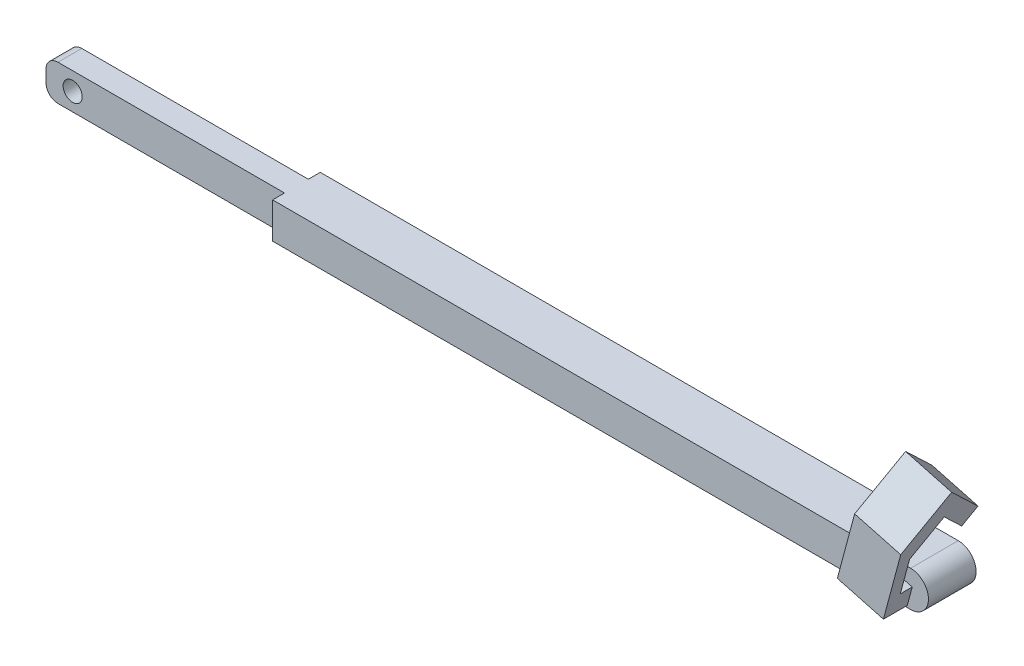
ISO-10303-21;
HEADER;
FILE_DESCRIPTION(('STEP AP214'),'2;1');
FILE_NAME('part.step','',(''),(''),'','','');
FILE_SCHEMA(('AUTOMOTIVE_DESIGN { 1 0 10303 214 1 1 1 1 }'));
ENDSEC;
DATA;
#1=APPLICATION_CONTEXT('core data for automotive mechanical design processes');
#2=APPLICATION_PROTOCOL_DEFINITION('international standard','automotive_design',2000,#1);
#3=PRODUCT_CONTEXT('',#1,'mechanical');
#4=PRODUCT('Part','Part','',(#3));
#5=PRODUCT_RELATED_PRODUCT_CATEGORY('part','',(#4));
#6=PRODUCT_DEFINITION_FORMATION('','',#4);
#7=PRODUCT_DEFINITION_CONTEXT('part definition',#1,'design');
#8=PRODUCT_DEFINITION('design','',#6,#7);
#9=PRODUCT_DEFINITION_SHAPE('','',#8);
#10=(LENGTH_UNIT() NAMED_UNIT(*) SI_UNIT(.MILLI.,.METRE.));
#11=(NAMED_UNIT(*) PLANE_ANGLE_UNIT() SI_UNIT($,.RADIAN.));
#12=(NAMED_UNIT(*) SI_UNIT($,.STERADIAN.) SOLID_ANGLE_UNIT());
#13=UNCERTAINTY_MEASURE_WITH_UNIT(LENGTH_MEASURE(1.E-05),#10,'distance_accuracy_value','');
#14=(GEOMETRIC_REPRESENTATION_CONTEXT(3) GLOBAL_UNCERTAINTY_ASSIGNED_CONTEXT((#13)) GLOBAL_UNIT_ASSIGNED_CONTEXT((#10,
#11,#12)) REPRESENTATION_CONTEXT('',''));
#15=CARTESIAN_POINT('',(0.,0.,0.));
#16=DIRECTION('',(0.,0.,1.));
#17=DIRECTION('',(1.,0.,0.));
#18=AXIS2_PLACEMENT_3D('',#15,#16,#17);
#19=CARTESIAN_POINT('',(-43.75,-3.74999999999999,-0.935028842544244));
#20=DIRECTION('',(1.,0.,0.));
#21=DIRECTION('',(0.,0.,-1.));
#22=AXIS2_PLACEMENT_3D('',#19,#20,#21);
#23=PLANE('',#22);
#24=DIRECTION('',(0.,-1.,0.));
#25=VECTOR('',#24,1.);
#26=CARTESIAN_POINT('',(-43.75,-3.74999999999999,2.5));
#27=LINE('',#26,#25);
#28=CARTESIAN_POINT('',(-43.75,3.75000000000002,2.5));
#29=VERTEX_POINT('',#28);
#30=CARTESIAN_POINT('',(-43.75,-3.74999999999999,2.5));
#31=VERTEX_POINT('',#30);
#32=EDGE_CURVE('E197',#29,#31,#27,.T.);
#33=ORIENTED_EDGE('',*,*,#32,.F.);
#34=DIRECTION('',(0.,0.,1.));
#35=VECTOR('',#34,1.);
#36=CARTESIAN_POINT('',(-43.75,3.75000000000002,10.));
#37=LINE('',#36,#35);
#38=CARTESIAN_POINT('',(-43.75,3.74999999999999,0.));
#39=VERTEX_POINT('',#38);
#40=EDGE_CURVE('E192',#39,#29,#37,.T.);
#41=ORIENTED_EDGE('',*,*,#40,.F.);
#42=DIRECTION('',(0.,1.,0.));
#43=VECTOR('',#42,1.);
#44=CARTESIAN_POINT('',(-43.75,0.,0.));
#45=LINE('',#44,#43);
#46=CARTESIAN_POINT('',(-43.75,-3.74999999999999,0.));
#47=VERTEX_POINT('',#46);
#48=EDGE_CURVE('E299',#47,#39,#45,.T.);
#49=ORIENTED_EDGE('',*,*,#48,.F.);
#50=DIRECTION('',(0.,0.,1.));
#51=VECTOR('',#50,1.);
#52=CARTESIAN_POINT('',(-43.75,-3.74999999999999,-0.935028842544244));
#53=LINE('',#52,#51);
#54=EDGE_CURVE('E302',#47,#31,#53,.T.);
#55=ORIENTED_EDGE('',*,*,#54,.T.);
#56=EDGE_LOOP('',(#33,#41,#49,#55));
#57=FACE_BOUND('',#56,.T.);
#58=ADVANCED_FACE('F35',(#57),#23,.F.);
#59=DIRECTION('',(0.,1.,0.));
#60=VECTOR('',#59,1.);
#61=CARTESIAN_POINT('',(-43.75,-3.74999999999999,7.5));
#62=LINE('',#61,#60);
#63=CARTESIAN_POINT('',(-43.75,-3.74999999999999,7.5));
#64=VERTEX_POINT('',#63);
#65=CARTESIAN_POINT('',(-43.75,3.74999999999999,7.5));
#66=VERTEX_POINT('',#65);
#67=EDGE_CURVE('E187',#64,#66,#62,.T.);
#68=ORIENTED_EDGE('',*,*,#67,.F.);
#69=CARTESIAN_POINT('',(-43.75,-3.74999999999999,10.));
#70=VERTEX_POINT('',#69);
#71=EDGE_CURVE('E291',#64,#70,#53,.T.);
#72=ORIENTED_EDGE('',*,*,#71,.T.);
#73=DIRECTION('',(0.,1.,0.));
#74=VECTOR('',#73,1.);
#75=CARTESIAN_POINT('',(-43.75,-3.74999999999999,10.));
#76=LINE('',#75,#74);
#77=CARTESIAN_POINT('',(-43.75,3.75000000000002,10.));
#78=VERTEX_POINT('',#77);
#79=EDGE_CURVE('E190',#70,#78,#76,.T.);
#80=ORIENTED_EDGE('',*,*,#79,.T.);
#81=EDGE_CURVE('E174',#66,#78,#37,.T.);
#82=ORIENTED_EDGE('',*,*,#81,.F.);
#83=EDGE_LOOP('',(#68,#72,#80,#82));
#84=FACE_BOUND('',#83,.T.);
#85=ADVANCED_FACE('F186',(#84),#23,.F.);
#86=CARTESIAN_POINT('',(94.4844666662507,15.950725063181,4.0147186257616));
#87=DIRECTION('',(0.18301270189222,0.683012701892216,0.70710678118655));
#88=DIRECTION('',(0.,-0.719254596676406,0.694746590606863));
#89=AXIS2_PLACEMENT_3D('',#86,#87,#88);
#90=PLANE('',#89);
#91=DIRECTION('',(-0.965925826289068,0.258819045102522,0.));
#92=VECTOR('',#91,1.);
#93=CARTESIAN_POINT('',(93.7816978909845,13.3279562879149,6.73000866551794));
#94=LINE('',#93,#92);
#95=CARTESIAN_POINT('',(93.7816978909845,13.3279562879149,6.73000866551794));
#96=VERTEX_POINT('',#95);
#97=CARTESIAN_POINT('',(84.1224396280939,15.9161467389401,6.73000866551794));
#98=VERTEX_POINT('',#97);
#99=EDGE_CURVE('E278',#96,#98,#94,.T.);
#100=ORIENTED_EDGE('',*,*,#99,.F.);
#101=DIRECTION('',(-0.183012701892221,-0.683012701892222,0.707106781186545));
#102=VECTOR('',#101,1.);
#103=CARTESIAN_POINT('',(94.4844666662507,15.950725063181,4.0147186257616));
#104=LINE('',#103,#102);
#105=CARTESIAN_POINT('',(92.288314243544,7.75457264047446,12.5));
#106=VERTEX_POINT('',#105);
#107=EDGE_CURVE('E210',#96,#106,#104,.T.);
#108=ORIENTED_EDGE('',*,*,#107,.T.);
#109=DIRECTION('',(0.965925826289068,-0.258819045102522,0.));
#110=VECTOR('',#109,1.);
#111=CARTESIAN_POINT('',(82.6290559806534,10.3427630914997,12.5));
#112=LINE('',#111,#110);
#113=CARTESIAN_POINT('',(82.6290559806534,10.3427630914997,12.5));
#114=VERTEX_POINT('',#113);
#115=EDGE_CURVE('E214',#114,#106,#112,.T.);
#116=ORIENTED_EDGE('',*,*,#115,.F.);
#117=DIRECTION('',(-0.183012701892221,-0.683012701892222,0.707106781186545));
#118=VECTOR('',#117,1.);
#119=CARTESIAN_POINT('',(84.82520840336,18.5389155142062,4.0147186257616));
#120=LINE('',#119,#118);
#121=EDGE_CURVE('E262',#98,#114,#120,.T.);
#122=ORIENTED_EDGE('',*,*,#121,.F.);
#123=EDGE_LOOP('',(#100,#108,#116,#122));
#124=FACE_BOUND('',#123,.T.);
#125=ADVANCED_FACE('F357',(#124),#90,.F.);
#126=CARTESIAN_POINT('',(80.6879131423844,3.09831939433166,15.));
#127=DIRECTION('',(-0.258819045102522,-0.965925826289068,0.));
#128=DIRECTION('',(0.965925826289068,-0.258819045102522,0.));
#129=AXIS2_PLACEMENT_3D('',#126,#127,#128);
#130=PLANE('',#129);
#131=DIRECTION('',(-0.965925826289068,0.258819045102522,0.));
#132=VECTOR('',#131,1.);
#133=CARTESIAN_POINT('',(80.6879131423844,3.09831939433167,12.5));
#134=LINE('',#133,#132);
#135=CARTESIAN_POINT('',(90.3471714052751,0.510128943306449,12.5));
#136=VERTEX_POINT('',#135);
#137=CARTESIAN_POINT('',(80.6879131423844,3.09831939433167,12.5));
#138=VERTEX_POINT('',#137);
#139=EDGE_CURVE('E260',#136,#138,#134,.T.);
#140=ORIENTED_EDGE('',*,*,#139,.F.);
#141=DIRECTION('',(0.,0.,-1.));
#142=VECTOR('',#141,1.);
#143=CARTESIAN_POINT('',(90.3471714052751,0.510128943306442,15.));
#144=LINE('',#143,#142);
#145=CARTESIAN_POINT('',(90.3471714052751,0.510128943306442,10.));
#146=VERTEX_POINT('',#145);
#147=EDGE_CURVE('E232',#136,#146,#144,.T.);
#148=ORIENTED_EDGE('',*,*,#147,.T.);
#149=DIRECTION('',(-0.965925826289068,0.258819045102521,0.));
#150=VECTOR('',#149,1.);
#151=CARTESIAN_POINT('',(80.6879131423844,3.09831939433166,10.));
#152=LINE('',#151,#150);
#153=CARTESIAN_POINT('',(80.6879131423844,3.09831939433166,10.));
#154=VERTEX_POINT('',#153);
#155=EDGE_CURVE('E234',#146,#154,#152,.T.);
#156=ORIENTED_EDGE('',*,*,#155,.T.);
#157=DIRECTION('',(0.,0.,-1.));
#158=VECTOR('',#157,1.);
#159=CARTESIAN_POINT('',(80.6879131423844,3.09831939433166,15.));
#160=LINE('',#159,#158);
#161=EDGE_CURVE('E235',#138,#154,#160,.T.);
#162=ORIENTED_EDGE('',*,*,#161,.F.);
#163=EDGE_LOOP('',(#140,#148,#156,#162));
#164=FACE_BOUND('',#163,.T.);
#165=ADVANCED_FACE('F375',(#164),#130,.F.);
#166=CARTESIAN_POINT('',(-90.,0.,10.));
#167=DIRECTION('',(0.,0.,1.));
#168=DIRECTION('',(1.,0.,0.));
#169=AXIS2_PLACEMENT_3D('',#166,#167,#168);
#170=PLANE('',#169);
#171=ORIENTED_EDGE('',*,*,#79,.F.);
#172=DIRECTION('',(1.,0.,0.));
#173=VECTOR('',#172,1.);
#174=CARTESIAN_POINT('',(-90.,-3.74999999999999,10.));
#175=LINE('',#174,#173);
#176=CARTESIAN_POINT('',(90.,-3.75000000000002,10.));
#177=VERTEX_POINT('',#176);
#178=EDGE_CURVE('E231',#70,#177,#175,.T.);
#179=ORIENTED_EDGE('',*,*,#178,.T.);
#180=CARTESIAN_POINT('',(90.,0.,10.));
#181=DIRECTION('',(0.,0.,1.));
#182=DIRECTION('',(1.,0.,0.));
#183=AXIS2_PLACEMENT_3D('',#180,#181,#182);
#184=CIRCLE('',#183,3.75000000000002);
#185=CARTESIAN_POINT('',(90.,3.75000000000004,10.));
#186=VERTEX_POINT('',#185);
#187=EDGE_CURVE('E228',#177,#186,#184,.T.);
#188=ORIENTED_EDGE('',*,*,#187,.T.);
#189=DIRECTION('',(-1.,0.,0.));
#190=VECTOR('',#189,1.);
#191=CARTESIAN_POINT('',(-90.,3.75000000000001,10.));
#192=LINE('',#191,#190);
#193=EDGE_CURVE('E230',#186,#78,#192,.T.);
#194=ORIENTED_EDGE('',*,*,#193,.T.);
#195=EDGE_LOOP('',(#171,#179,#188,#194));
#196=FACE_BOUND('',#195,.T.);
#197=ORIENTED_EDGE('',*,*,#155,.F.);
#198=DIRECTION('',(0.258819045102523,0.965925826289068,0.));
#199=VECTOR('',#198,1.);
#200=CARTESIAN_POINT('',(90.3471714052751,0.510128943306442,10.));
#201=LINE('',#200,#199);
#202=CARTESIAN_POINT('',(89.311895224865,-3.35357436184983,10.));
#203=VERTEX_POINT('',#202);
#204=EDGE_CURVE('E246',#203,#146,#201,.T.);
#205=ORIENTED_EDGE('',*,*,#204,.F.);
#206=DIRECTION('',(0.965925826289068,-0.258819045102521,0.));
#207=VECTOR('',#206,1.);
#208=CARTESIAN_POINT('',(79.6526369619744,-0.765383910824613,10.));
#209=LINE('',#208,#207);
#210=CARTESIAN_POINT('',(79.6526369619744,-0.765383910824612,10.));
#211=VERTEX_POINT('',#210);
#212=EDGE_CURVE('E242',#211,#203,#209,.T.);
#213=ORIENTED_EDGE('',*,*,#212,.F.);
#214=DIRECTION('',(-0.258819045102519,-0.965925826289069,0.));
#215=VECTOR('',#214,1.);
#216=CARTESIAN_POINT('',(80.6879131423844,3.09831939433166,10.));
#217=LINE('',#216,#215);
#218=EDGE_CURVE('E237',#154,#211,#217,.T.);
#219=ORIENTED_EDGE('',*,*,#218,.F.);
#220=EDGE_LOOP('',(#197,#205,#213,#219));
#221=FACE_BOUND('',#220,.T.);
#222=ADVANCED_FACE('F372',(#196,#221),#170,.T.);
#223=CARTESIAN_POINT('',(-90.,0.,0.));
#224=DIRECTION('',(0.,0.,1.));
#225=DIRECTION('',(1.,0.,0.));
#226=AXIS2_PLACEMENT_3D('',#223,#224,#225);
#227=PLANE('',#226);
#228=DIRECTION('',(1.,0.,0.));
#229=VECTOR('',#228,1.);
#230=CARTESIAN_POINT('',(-90.,-3.74999999999999,0.));
#231=LINE('',#230,#229);
#232=CARTESIAN_POINT('',(90.,-3.75000000000002,0.));
#233=VERTEX_POINT('',#232);
#234=EDGE_CURVE('E227',#47,#233,#231,.T.);
#235=ORIENTED_EDGE('',*,*,#234,.F.);
#236=ORIENTED_EDGE('',*,*,#48,.T.);
#237=DIRECTION('',(-1.,0.,0.));
#238=VECTOR('',#237,1.);
#239=CARTESIAN_POINT('',(-90.,3.75000000000001,0.));
#240=LINE('',#239,#238);
#241=CARTESIAN_POINT('',(90.,3.75000000000004,0.));
#242=VERTEX_POINT('',#241);
#243=EDGE_CURVE('E193',#242,#39,#240,.T.);
#244=ORIENTED_EDGE('',*,*,#243,.F.);
#245=CARTESIAN_POINT('',(90.,0.,0.));
#246=DIRECTION('',(0.,0.,1.));
#247=DIRECTION('',(1.,0.,0.));
#248=AXIS2_PLACEMENT_3D('',#245,#246,#247);
#249=CIRCLE('',#248,3.75000000000002);
#250=EDGE_CURVE('E222',#233,#242,#249,.T.);
#251=ORIENTED_EDGE('',*,*,#250,.F.);
#252=EDGE_LOOP('',(#235,#236,#244,#251));
#253=FACE_BOUND('',#252,.T.);
#254=ADVANCED_FACE('F366',(#253),#227,.F.);
#255=CARTESIAN_POINT('',(-90.,-3.74999999999999,10.));
#256=DIRECTION('',(0.,1.,0.));
#257=DIRECTION('',(0.,0.,1.));
#258=AXIS2_PLACEMENT_3D('',#255,#256,#257);
#259=PLANE('',#258);
#260=DIRECTION('',(1.,0.,0.));
#261=VECTOR('',#260,1.);
#262=CARTESIAN_POINT('',(-93.75,-3.74999999999999,7.5));
#263=LINE('',#262,#261);
#264=CARTESIAN_POINT('',(-91.25,-3.74999999999999,7.5));
#265=VERTEX_POINT('',#264);
#266=EDGE_CURVE('E181',#265,#64,#263,.T.);
#267=ORIENTED_EDGE('',*,*,#266,.F.);
#268=DIRECTION('',(0.,0.,1.));
#269=VECTOR('',#268,1.);
#270=CARTESIAN_POINT('',(-91.25,-3.74999999999999,10.));
#271=LINE('',#270,#269);
#272=CARTESIAN_POINT('',(-91.25,-3.74999999999999,2.5));
#273=VERTEX_POINT('',#272);
#274=EDGE_CURVE('E43',#265,#273,#271,.F.);
#275=ORIENTED_EDGE('',*,*,#274,.T.);
#276=DIRECTION('',(1.,0.,0.));
#277=VECTOR('',#276,1.);
#278=CARTESIAN_POINT('',(-93.75,-3.74999999999999,2.5));
#279=LINE('',#278,#277);
#280=EDGE_CURVE('E209',#273,#31,#279,.T.);
#281=ORIENTED_EDGE('',*,*,#280,.T.);
#282=ORIENTED_EDGE('',*,*,#54,.F.);
#283=ORIENTED_EDGE('',*,*,#234,.T.);
#284=DIRECTION('',(0.,0.,-1.));
#285=VECTOR('',#284,1.);
#286=CARTESIAN_POINT('',(90.,-3.75000000000002,10.));
#287=LINE('',#286,#285);
#288=EDGE_CURVE('E219',#177,#233,#287,.T.);
#289=ORIENTED_EDGE('',*,*,#288,.F.);
#290=ORIENTED_EDGE('',*,*,#178,.F.);
#291=ORIENTED_EDGE('',*,*,#71,.F.);
#292=EDGE_LOOP('',(#267,#275,#281,#282,#283,#289,#290,#291));
#293=FACE_BOUND('',#292,.T.);
#294=ADVANCED_FACE('F362',(#293),#259,.F.);
#295=CARTESIAN_POINT('',(90.,0.,10.));
#296=DIRECTION('',(0.,0.,-1.));
#297=DIRECTION('',(-1.,0.,0.));
#298=AXIS2_PLACEMENT_3D('',#295,#296,#297);
#299=CYLINDRICAL_SURFACE('',#298,3.75000000000002);
#300=ORIENTED_EDGE('',*,*,#250,.T.);
#301=DIRECTION('',(0.,0.,-1.));
#302=VECTOR('',#301,1.);
#303=CARTESIAN_POINT('',(90.,3.75000000000004,10.));
#304=LINE('',#303,#302);
#305=EDGE_CURVE('E213',#186,#242,#304,.T.);
#306=ORIENTED_EDGE('',*,*,#305,.F.);
#307=ORIENTED_EDGE('',*,*,#187,.F.);
#308=ORIENTED_EDGE('',*,*,#288,.T.);
#309=EDGE_LOOP('',(#300,#306,#307,#308));
#310=FACE_BOUND('',#309,.T.);
#311=ADVANCED_FACE('F365',(#310),#299,.T.);
#312=CARTESIAN_POINT('',(-90.,3.75000000000001,10.));
#313=DIRECTION('',(0.,-1.,0.));
#314=DIRECTION('',(1.,0.,0.));
#315=AXIS2_PLACEMENT_3D('',#312,#313,#314);
#316=PLANE('',#315);
#317=DIRECTION('',(1.,0.,0.));
#318=VECTOR('',#317,1.);
#319=CARTESIAN_POINT('',(-93.75,3.74999999999999,2.5));
#320=LINE('',#319,#318);
#321=CARTESIAN_POINT('',(-91.25,3.74999999999999,2.5));
#322=VERTEX_POINT('',#321);
#323=EDGE_CURVE('E182',#322,#29,#320,.T.);
#324=ORIENTED_EDGE('',*,*,#323,.F.);
#325=DIRECTION('',(0.,0.,-1.));
#326=VECTOR('',#325,1.);
#327=CARTESIAN_POINT('',(-91.25,3.75000000000001,10.));
#328=LINE('',#327,#326);
#329=CARTESIAN_POINT('',(-91.25,3.74999999999999,7.5));
#330=VERTEX_POINT('',#329);
#331=EDGE_CURVE('E177',#322,#330,#328,.F.);
#332=ORIENTED_EDGE('',*,*,#331,.T.);
#333=DIRECTION('',(1.,0.,0.));
#334=VECTOR('',#333,1.);
#335=CARTESIAN_POINT('',(-93.75,3.74999999999999,7.5));
#336=LINE('',#335,#334);
#337=EDGE_CURVE('E169',#330,#66,#336,.T.);
#338=ORIENTED_EDGE('',*,*,#337,.T.);
#339=ORIENTED_EDGE('',*,*,#81,.T.);
#340=ORIENTED_EDGE('',*,*,#193,.F.);
#341=ORIENTED_EDGE('',*,*,#305,.T.);
#342=ORIENTED_EDGE('',*,*,#243,.T.);
#343=ORIENTED_EDGE('',*,*,#40,.T.);
#344=EDGE_LOOP('',(#324,#332,#338,#339,#340,#341,#342,#343));
#345=FACE_BOUND('',#344,.T.);
#346=ADVANCED_FACE('F172',(#345),#316,.F.);
#347=CARTESIAN_POINT('',(90.3471714052751,0.510128943306442,15.));
#348=DIRECTION('',(-0.965925826289068,0.258819045102523,0.));
#349=DIRECTION('',(-0.258819045102523,-0.965925826289068,0.));
#350=AXIS2_PLACEMENT_3D('',#347,#348,#349);
#351=PLANE('',#350);
#352=DIRECTION('',(-0.258819045102521,-0.965925826289068,0.));
#353=VECTOR('',#352,1.);
#354=CARTESIAN_POINT('',(92.9353618563003,10.1693872061971,12.5));
#355=LINE('',#354,#353);
#356=EDGE_CURVE('E217',#106,#136,#355,.T.);
#357=ORIENTED_EDGE('',*,*,#356,.F.);
#358=ORIENTED_EDGE('',*,*,#107,.F.);
#359=DIRECTION('',(0.183012701892219,0.683012701892217,0.70710678118655));
#360=VECTOR('',#359,1.);
#361=CARTESIAN_POINT('',(92.500608977739,8.54686737466935,1.78026119721209));
#362=LINE('',#361,#360);
#363=CARTESIAN_POINT('',(92.500608977739,8.54686737466935,1.78026119721209));
#364=VERTEX_POINT('',#363);
#365=EDGE_CURVE('E282',#364,#96,#362,.T.);
#366=ORIENTED_EDGE('',*,*,#365,.F.);
#367=DIRECTION('',(-0.183012701892226,-0.683012701892221,0.707106781186544));
#368=VECTOR('',#367,1.);
#369=CARTESIAN_POINT('',(93.2033777530052,11.1696361499355,-0.93502884254424));
#370=LINE('',#369,#368);
#371=CARTESIAN_POINT('',(93.2033777530052,11.1696361499355,-0.93502884254424));
#372=VERTEX_POINT('',#371);
#373=EDGE_CURVE('E284',#372,#364,#370,.T.);
#374=ORIENTED_EDGE('',*,*,#373,.F.);
#375=DIRECTION('',(-0.183012701892223,-0.683012701892216,-0.70710678118655));
#376=VECTOR('',#375,1.);
#377=CARTESIAN_POINT('',(94.4844666662507,15.950725063181,4.0147186257616));
#378=LINE('',#377,#376);
#379=CARTESIAN_POINT('',(95.131514279007,18.3655396289036,6.51471862576161));
#380=VERTEX_POINT('',#379);
#381=EDGE_CURVE('E273',#380,#372,#378,.T.);
#382=ORIENTED_EDGE('',*,*,#381,.F.);
#383=DIRECTION('',(-0.183012701892221,-0.683012701892222,0.707106781186545));
#384=VECTOR('',#383,1.);
#385=CARTESIAN_POINT('',(95.131514279007,18.3655396289036,6.51471862576161));
#386=LINE('',#385,#384);
#387=CARTESIAN_POINT('',(92.9353618563003,10.169387206197,15.0000000000001));
#388=VERTEX_POINT('',#387);
#389=EDGE_CURVE('E225',#380,#388,#386,.T.);
#390=ORIENTED_EDGE('',*,*,#389,.T.);
#391=DIRECTION('',(0.258819045102523,0.965925826289068,0.));
#392=VECTOR('',#391,1.);
#393=CARTESIAN_POINT('',(90.3471714052751,0.510128943306442,15.));
#394=LINE('',#393,#392);
#395=CARTESIAN_POINT('',(89.311895224865,-3.35357436184983,15.));
#396=VERTEX_POINT('',#395);
#397=EDGE_CURVE('E241',#396,#388,#394,.T.);
#398=ORIENTED_EDGE('',*,*,#397,.F.);
#399=DIRECTION('',(0.,0.,-1.));
#400=VECTOR('',#399,1.);
#401=CARTESIAN_POINT('',(89.311895224865,-3.35357436184983,15.));
#402=LINE('',#401,#400);
#403=EDGE_CURVE('E243',#396,#203,#402,.T.);
#404=ORIENTED_EDGE('',*,*,#403,.T.);
#405=ORIENTED_EDGE('',*,*,#204,.T.);
#406=ORIENTED_EDGE('',*,*,#147,.F.);
#407=EDGE_LOOP('',(#357,#358,#366,#374,#382,#390,#398,#404,#405,#406));
#408=FACE_BOUND('',#407,.T.);
#409=ADVANCED_FACE('F369',(#408),#351,.F.);
#410=CARTESIAN_POINT('',(80.6879131423844,3.09831939433166,15.));
#411=DIRECTION('',(0.965925826289069,-0.258819045102519,0.));
#412=DIRECTION('',(0.258819045102519,0.965925826289069,0.));
#413=AXIS2_PLACEMENT_3D('',#410,#411,#412);
#414=PLANE('',#413);
#415=DIRECTION('',(-0.258819045102519,-0.965925826289069,0.));
#416=VECTOR('',#415,1.);
#417=CARTESIAN_POINT('',(80.6879131423844,3.09831939433166,15.));
#418=LINE('',#417,#416);
#419=CARTESIAN_POINT('',(83.2761035934097,12.7575776572223,15.));
#420=VERTEX_POINT('',#419);
#421=CARTESIAN_POINT('',(79.6526369619744,-0.765383910824613,15.));
#422=VERTEX_POINT('',#421);
#423=EDGE_CURVE('E256',#420,#422,#418,.T.);
#424=ORIENTED_EDGE('',*,*,#423,.F.);
#425=DIRECTION('',(-0.183012701892221,-0.683012701892222,0.707106781186545));
#426=VECTOR('',#425,1.);
#427=CARTESIAN_POINT('',(85.4722560161163,20.9537300799289,6.51471862576161));
#428=LINE('',#427,#426);
#429=CARTESIAN_POINT('',(85.4722560161163,20.9537300799289,6.51471862576161));
#430=VERTEX_POINT('',#429);
#431=EDGE_CURVE('E268',#430,#420,#428,.T.);
#432=ORIENTED_EDGE('',*,*,#431,.F.);
#433=DIRECTION('',(0.183012701892219,0.683012701892216,0.70710678118655));
#434=VECTOR('',#433,1.);
#435=CARTESIAN_POINT('',(84.82520840336,18.5389155142062,4.0147186257616));
#436=LINE('',#435,#434);
#437=CARTESIAN_POINT('',(83.5441194901145,13.7578266009607,-0.935028842544244));
#438=VERTEX_POINT('',#437);
#439=EDGE_CURVE('E279',#438,#430,#436,.T.);
#440=ORIENTED_EDGE('',*,*,#439,.F.);
#441=DIRECTION('',(0.183012701892226,0.683012701892221,-0.707106781186544));
#442=VECTOR('',#441,1.);
#443=CARTESIAN_POINT('',(83.5441194901145,13.7578266009607,-0.935028842544244));
#444=LINE('',#443,#442);
#445=CARTESIAN_POINT('',(82.8413507148483,11.1350578256946,1.78026119721209));
#446=VERTEX_POINT('',#445);
#447=EDGE_CURVE('E292',#446,#438,#444,.T.);
#448=ORIENTED_EDGE('',*,*,#447,.F.);
#449=DIRECTION('',(0.183012701892219,0.683012701892217,0.70710678118655));
#450=VECTOR('',#449,1.);
#451=CARTESIAN_POINT('',(82.8413507148483,11.1350578256946,1.78026119721209));
#452=LINE('',#451,#450);
#453=EDGE_CURVE('E254',#446,#98,#452,.T.);
#454=ORIENTED_EDGE('',*,*,#453,.T.);
#455=ORIENTED_EDGE('',*,*,#121,.T.);
#456=DIRECTION('',(-0.258819045102521,-0.965925826289068,0.));
#457=VECTOR('',#456,1.);
#458=CARTESIAN_POINT('',(83.2761035934097,12.7575776572223,12.5));
#459=LINE('',#458,#457);
#460=EDGE_CURVE('E238',#114,#138,#459,.T.);
#461=ORIENTED_EDGE('',*,*,#460,.T.);
#462=ORIENTED_EDGE('',*,*,#161,.T.);
#463=ORIENTED_EDGE('',*,*,#218,.T.);
#464=DIRECTION('',(0.,0.,-1.));
#465=VECTOR('',#464,1.);
#466=CARTESIAN_POINT('',(79.6526369619744,-0.765383910824613,15.));
#467=LINE('',#466,#465);
#468=EDGE_CURVE('E239',#422,#211,#467,.T.);
#469=ORIENTED_EDGE('',*,*,#468,.F.);
#470=EDGE_LOOP('',(#424,#432,#440,#448,#454,#455,#461,#462,#463,#469));
#471=FACE_BOUND('',#470,.T.);
#472=ADVANCED_FACE('F410',(#471),#414,.F.);
#473=CARTESIAN_POINT('',(79.6526369619744,-0.765383910824613,15.));
#474=DIRECTION('',(0.258819045102521,0.965925826289068,0.));
#475=DIRECTION('',(-0.965925826289068,0.258819045102521,0.));
#476=AXIS2_PLACEMENT_3D('',#473,#474,#475);
#477=PLANE('',#476);
#478=ORIENTED_EDGE('',*,*,#212,.T.);
#479=ORIENTED_EDGE('',*,*,#403,.F.);
#480=DIRECTION('',(0.965925826289068,-0.258819045102521,0.));
#481=VECTOR('',#480,1.);
#482=CARTESIAN_POINT('',(79.6526369619744,-0.765383910824613,15.));
#483=LINE('',#482,#481);
#484=EDGE_CURVE('E218',#422,#396,#483,.T.);
#485=ORIENTED_EDGE('',*,*,#484,.F.);
#486=ORIENTED_EDGE('',*,*,#468,.T.);
#487=EDGE_LOOP('',(#478,#479,#485,#486));
#488=FACE_BOUND('',#487,.T.);
#489=ADVANCED_FACE('F407',(#488),#477,.F.);
#490=CARTESIAN_POINT('',(0.,0.,15.));
#491=DIRECTION('',(0.,0.,1.));
#492=DIRECTION('',(1.,0.,0.));
#493=AXIS2_PLACEMENT_3D('',#490,#491,#492);
#494=PLANE('',#493);
#495=ORIENTED_EDGE('',*,*,#397,.T.);
#496=DIRECTION('',(0.965925826289068,-0.258819045102522,0.));
#497=VECTOR('',#496,1.);
#498=CARTESIAN_POINT('',(83.2761035934097,12.7575776572223,15.));
#499=LINE('',#498,#497);
#500=EDGE_CURVE('E265',#420,#388,#499,.T.);
#501=ORIENTED_EDGE('',*,*,#500,.F.);
#502=ORIENTED_EDGE('',*,*,#423,.T.);
#503=ORIENTED_EDGE('',*,*,#484,.T.);
#504=EDGE_LOOP('',(#495,#501,#502,#503));
#505=FACE_BOUND('',#504,.T.);
#506=ADVANCED_FACE('F437',(#505),#494,.T.);
#507=CARTESIAN_POINT('',(83.2761035934097,12.7575776572223,12.5));
#508=DIRECTION('',(0.,0.,1.));
#509=DIRECTION('',(1.,0.,0.));
#510=AXIS2_PLACEMENT_3D('',#507,#508,#509);
#511=PLANE('',#510);
#512=ORIENTED_EDGE('',*,*,#460,.F.);
#513=ORIENTED_EDGE('',*,*,#115,.T.);
#514=ORIENTED_EDGE('',*,*,#356,.T.);
#515=ORIENTED_EDGE('',*,*,#139,.T.);
#516=EDGE_LOOP('',(#512,#513,#514,#515));
#517=FACE_BOUND('',#516,.T.);
#518=ADVANCED_FACE('F415',(#517),#511,.F.);
#519=CARTESIAN_POINT('',(95.131514279007,18.3655396289036,6.51471862576161));
#520=DIRECTION('',(-0.183012701892219,-0.683012701892216,-0.70710678118655));
#521=DIRECTION('',(0.,0.719254596676406,-0.694746590606863));
#522=AXIS2_PLACEMENT_3D('',#519,#520,#521);
#523=PLANE('',#522);
#524=ORIENTED_EDGE('',*,*,#500,.T.);
#525=ORIENTED_EDGE('',*,*,#389,.F.);
#526=DIRECTION('',(0.965925826289068,-0.258819045102522,0.));
#527=VECTOR('',#526,1.);
#528=CARTESIAN_POINT('',(95.131514279007,18.3655396289036,6.51471862576161));
#529=LINE('',#528,#527);
#530=EDGE_CURVE('E276',#430,#380,#529,.T.);
#531=ORIENTED_EDGE('',*,*,#530,.F.);
#532=ORIENTED_EDGE('',*,*,#431,.T.);
#533=EDGE_LOOP('',(#524,#525,#531,#532));
#534=FACE_BOUND('',#533,.T.);
#535=ADVANCED_FACE('F434',(#534),#523,.F.);
#536=CARTESIAN_POINT('',(4.63892737992363,17.3127126744973,-17.9234390501907));
#537=DIRECTION('',(-0.183012701892221,-0.683012701892222,0.707106781186545));
#538=DIRECTION('',(0.,-0.719254596676401,-0.694746590606868));
#539=AXIS2_PLACEMENT_3D('',#536,#537,#538);
#540=PLANE('',#539);
#541=ORIENTED_EDGE('',*,*,#381,.T.);
#542=DIRECTION('',(0.965925826289068,-0.258819045102522,0.));
#543=VECTOR('',#542,1.);
#544=CARTESIAN_POINT('',(93.2033777530052,11.1696361499355,-0.93502884254424));
#545=LINE('',#544,#543);
#546=EDGE_CURVE('E288',#438,#372,#545,.T.);
#547=ORIENTED_EDGE('',*,*,#546,.F.);
#548=ORIENTED_EDGE('',*,*,#439,.T.);
#549=ORIENTED_EDGE('',*,*,#530,.T.);
#550=EDGE_LOOP('',(#541,#547,#548,#549));
#551=FACE_BOUND('',#550,.T.);
#552=ADVANCED_FACE('F429',(#551),#540,.F.);
#553=CARTESIAN_POINT('',(92.500608977739,8.54686737466935,1.78026119721209));
#554=DIRECTION('',(0.183012701892221,0.683012701892222,-0.707106781186545));
#555=DIRECTION('',(0.,0.719254596676401,0.694746590606868));
#556=AXIS2_PLACEMENT_3D('',#553,#554,#555);
#557=PLANE('',#556);
#558=ORIENTED_EDGE('',*,*,#99,.T.);
#559=ORIENTED_EDGE('',*,*,#453,.F.);
#560=DIRECTION('',(-0.965925826289068,0.258819045102522,0.));
#561=VECTOR('',#560,1.);
#562=CARTESIAN_POINT('',(92.500608977739,8.54686737466935,1.78026119721209));
#563=LINE('',#562,#561);
#564=EDGE_CURVE('E295',#364,#446,#563,.T.);
#565=ORIENTED_EDGE('',*,*,#564,.F.);
#566=ORIENTED_EDGE('',*,*,#365,.T.);
#567=EDGE_LOOP('',(#558,#559,#565,#566));
#568=FACE_BOUND('',#567,.T.);
#569=ADVANCED_FACE('F423',(#568),#557,.F.);
#570=CARTESIAN_POINT('',(4.39692410775294,16.4095441671584,16.9884102076464));
#571=DIRECTION('',(-0.183012701892219,-0.683012701892216,-0.707106781186551));
#572=DIRECTION('',(0.,0.719254596676407,-0.694746590606863));
#573=AXIS2_PLACEMENT_3D('',#570,#571,#572);
#574=PLANE('',#573);
#575=ORIENTED_EDGE('',*,*,#373,.T.);
#576=ORIENTED_EDGE('',*,*,#564,.T.);
#577=ORIENTED_EDGE('',*,*,#447,.T.);
#578=ORIENTED_EDGE('',*,*,#546,.T.);
#579=EDGE_LOOP('',(#575,#576,#577,#578));
#580=FACE_BOUND('',#579,.T.);
#581=ADVANCED_FACE('F348',(#580),#574,.T.);
#582=CARTESIAN_POINT('',(-93.75,-3.74999999999999,2.5));
#583=DIRECTION('',(0.,0.,1.));
#584=DIRECTION('',(1.,0.,0.));
#585=AXIS2_PLACEMENT_3D('',#582,#583,#584);
#586=PLANE('',#585);
#587=CARTESIAN_POINT('',(-88.1599905508897,0.,2.5));
#588=DIRECTION('',(0.,0.,1.));
#589=DIRECTION('',(1.,0.,0.));
#590=AXIS2_PLACEMENT_3D('',#587,#588,#589);
#591=CIRCLE('',#590,2.);
#592=CARTESIAN_POINT('',(-86.1599905508897,0.,2.5));
#593=VERTEX_POINT('',#592);
#594=EDGE_CURVE('E203',#593,#593,#591,.T.);
#595=ORIENTED_EDGE('',*,*,#594,.T.);
#596=EDGE_LOOP('',(#595));
#597=FACE_BOUND('',#596,.T.);
#598=ORIENTED_EDGE('',*,*,#280,.F.);
#599=CARTESIAN_POINT('',(-91.25,-1.24999999999999,2.5));
#600=DIRECTION('',(0.,0.,1.));
#601=DIRECTION('',(1.,0.,0.));
#602=AXIS2_PLACEMENT_3D('',#599,#600,#601);
#603=CIRCLE('',#602,2.5);
#604=CARTESIAN_POINT('',(-93.75,-1.24999999999999,2.5));
#605=VERTEX_POINT('',#604);
#606=EDGE_CURVE('E11',#273,#605,#603,.F.);
#607=ORIENTED_EDGE('',*,*,#606,.T.);
#608=DIRECTION('',(0.,-1.,0.));
#609=VECTOR('',#608,1.);
#610=CARTESIAN_POINT('',(-93.75,-3.74999999999999,2.5));
#611=LINE('',#610,#609);
#612=CARTESIAN_POINT('',(-93.75,1.25000000000001,2.5));
#613=VERTEX_POINT('',#612);
#614=EDGE_CURVE('E196',#613,#605,#611,.T.);
#615=ORIENTED_EDGE('',*,*,#614,.F.);
#616=CARTESIAN_POINT('',(-91.25,1.25000000000001,2.5));
#617=DIRECTION('',(0.,0.,1.));
#618=DIRECTION('',(1.,0.,0.));
#619=AXIS2_PLACEMENT_3D('',#616,#617,#618);
#620=CIRCLE('',#619,2.5);
#621=EDGE_CURVE('E314',#613,#322,#620,.F.);
#622=ORIENTED_EDGE('',*,*,#621,.T.);
#623=ORIENTED_EDGE('',*,*,#323,.T.);
#624=ORIENTED_EDGE('',*,*,#32,.T.);
#625=EDGE_LOOP('',(#598,#607,#615,#622,#623,#624));
#626=FACE_BOUND('',#625,.T.);
#627=ADVANCED_FACE('F340',(#597,#626),#586,.F.);
#628=CARTESIAN_POINT('',(-93.75,-3.74999999999999,7.5));
#629=DIRECTION('',(0.,0.,-1.));
#630=DIRECTION('',(0.,1.,0.));
#631=AXIS2_PLACEMENT_3D('',#628,#629,#630);
#632=PLANE('',#631);
#633=CARTESIAN_POINT('',(-88.1599905508897,0.,7.5));
#634=DIRECTION('',(0.,0.,1.));
#635=DIRECTION('',(1.,0.,0.));
#636=AXIS2_PLACEMENT_3D('',#633,#634,#635);
#637=CIRCLE('',#636,2.);
#638=CARTESIAN_POINT('',(-86.1599905508897,0.,7.5));
#639=VERTEX_POINT('',#638);
#640=EDGE_CURVE('E332',#639,#639,#637,.T.);
#641=ORIENTED_EDGE('',*,*,#640,.F.);
#642=EDGE_LOOP('',(#641));
#643=FACE_BOUND('',#642,.T.);
#644=DIRECTION('',(0.,1.,0.));
#645=VECTOR('',#644,1.);
#646=CARTESIAN_POINT('',(-93.75,-3.74999999999999,7.5));
#647=LINE('',#646,#645);
#648=CARTESIAN_POINT('',(-93.75,-1.24999999999999,7.5));
#649=VERTEX_POINT('',#648);
#650=CARTESIAN_POINT('',(-93.75,1.25000000000001,7.5));
#651=VERTEX_POINT('',#650);
#652=EDGE_CURVE('E200',#649,#651,#647,.T.);
#653=ORIENTED_EDGE('',*,*,#652,.F.);
#654=CARTESIAN_POINT('',(-91.25,-1.24999999999999,7.5));
#655=DIRECTION('',(0.,0.,-1.));
#656=DIRECTION('',(0.,1.,0.));
#657=AXIS2_PLACEMENT_3D('',#654,#655,#656);
#658=CIRCLE('',#657,2.5);
#659=EDGE_CURVE('E57',#649,#265,#658,.F.);
#660=ORIENTED_EDGE('',*,*,#659,.T.);
#661=ORIENTED_EDGE('',*,*,#266,.T.);
#662=ORIENTED_EDGE('',*,*,#67,.T.);
#663=ORIENTED_EDGE('',*,*,#337,.F.);
#664=CARTESIAN_POINT('',(-91.25,1.25000000000001,7.5));
#665=DIRECTION('',(0.,0.,-1.));
#666=DIRECTION('',(0.,1.,0.));
#667=AXIS2_PLACEMENT_3D('',#664,#665,#666);
#668=CIRCLE('',#667,2.5);
#669=EDGE_CURVE('E317',#330,#651,#668,.F.);
#670=ORIENTED_EDGE('',*,*,#669,.T.);
#671=EDGE_LOOP('',(#653,#660,#661,#662,#663,#670));
#672=FACE_BOUND('',#671,.T.);
#673=ADVANCED_FACE('F195',(#643,#672),#632,.F.);
#674=CARTESIAN_POINT('',(-93.75,0.,0.));
#675=DIRECTION('',(1.,0.,0.));
#676=DIRECTION('',(0.,0.,-1.));
#677=AXIS2_PLACEMENT_3D('',#674,#675,#676);
#678=PLANE('',#677);
#679=ORIENTED_EDGE('',*,*,#614,.T.);
#680=DIRECTION('',(0.,0.,1.));
#681=VECTOR('',#680,1.);
#682=CARTESIAN_POINT('',(-93.75,-1.24999999999999,0.));
#683=LINE('',#682,#681);
#684=EDGE_CURVE('E319',#605,#649,#683,.T.);
#685=ORIENTED_EDGE('',*,*,#684,.T.);
#686=ORIENTED_EDGE('',*,*,#652,.T.);
#687=DIRECTION('',(0.,0.,-1.));
#688=VECTOR('',#687,1.);
#689=CARTESIAN_POINT('',(-93.75,1.25000000000001,0.));
#690=LINE('',#689,#688);
#691=EDGE_CURVE('E306',#651,#613,#690,.T.);
#692=ORIENTED_EDGE('',*,*,#691,.T.);
#693=EDGE_LOOP('',(#679,#685,#686,#692));
#694=FACE_BOUND('',#693,.T.);
#695=ADVANCED_FACE('F324',(#694),#678,.F.);
#696=CARTESIAN_POINT('',(-91.25,1.25000000000001,0.));
#697=DIRECTION('',(0.,0.,-1.));
#698=DIRECTION('',(-1.,0.,0.));
#699=AXIS2_PLACEMENT_3D('',#696,#697,#698);
#700=CYLINDRICAL_SURFACE('',#699,2.5);
#701=ORIENTED_EDGE('',*,*,#669,.F.);
#702=ORIENTED_EDGE('',*,*,#331,.F.);
#703=ORIENTED_EDGE('',*,*,#621,.F.);
#704=ORIENTED_EDGE('',*,*,#691,.F.);
#705=EDGE_LOOP('',(#701,#702,#703,#704));
#706=FACE_BOUND('',#705,.T.);
#707=ADVANCED_FACE('F346',(#706),#700,.T.);
#708=CARTESIAN_POINT('',(-91.25,-1.24999999999999,0.));
#709=DIRECTION('',(0.,0.,1.));
#710=DIRECTION('',(1.,0.,0.));
#711=AXIS2_PLACEMENT_3D('',#708,#709,#710);
#712=CYLINDRICAL_SURFACE('',#711,2.5);
#713=ORIENTED_EDGE('',*,*,#606,.F.);
#714=ORIENTED_EDGE('',*,*,#274,.F.);
#715=ORIENTED_EDGE('',*,*,#659,.F.);
#716=ORIENTED_EDGE('',*,*,#684,.F.);
#717=EDGE_LOOP('',(#713,#714,#715,#716));
#718=FACE_BOUND('',#717,.T.);
#719=ADVANCED_FACE('F37',(#718),#712,.T.);
#720=CARTESIAN_POINT('',(-88.1599905508897,0.,-42.5));
#721=DIRECTION('',(0.,0.,1.));
#722=DIRECTION('',(1.,0.,0.));
#723=AXIS2_PLACEMENT_3D('',#720,#721,#722);
#724=CYLINDRICAL_SURFACE('',#723,2.);
#725=ORIENTED_EDGE('',*,*,#640,.T.);
#726=EDGE_LOOP('',(#725));
#727=FACE_BOUND('',#726,.T.);
#728=ORIENTED_EDGE('',*,*,#594,.F.);
#729=EDGE_LOOP('',(#728));
#730=FACE_BOUND('',#729,.T.);
#731=ADVANCED_FACE('F336',(#727,#730),#724,.F.);
#732=CLOSED_SHELL('',(#58,#85,#125,#165,#222,#254,#294,#311,#346,#409,#472,#489,#506,#518,#535,
#552,#569,#581,#627,#673,#695,#707,#719,#731));
#733=MANIFOLD_SOLID_BREP('B2',#732);
#734=ADVANCED_BREP_SHAPE_REPRESENTATION('',(#18,#733),#14);
#735=SHAPE_DEFINITION_REPRESENTATION(#9,#734);
ENDSEC;
END-ISO-10303-21;
